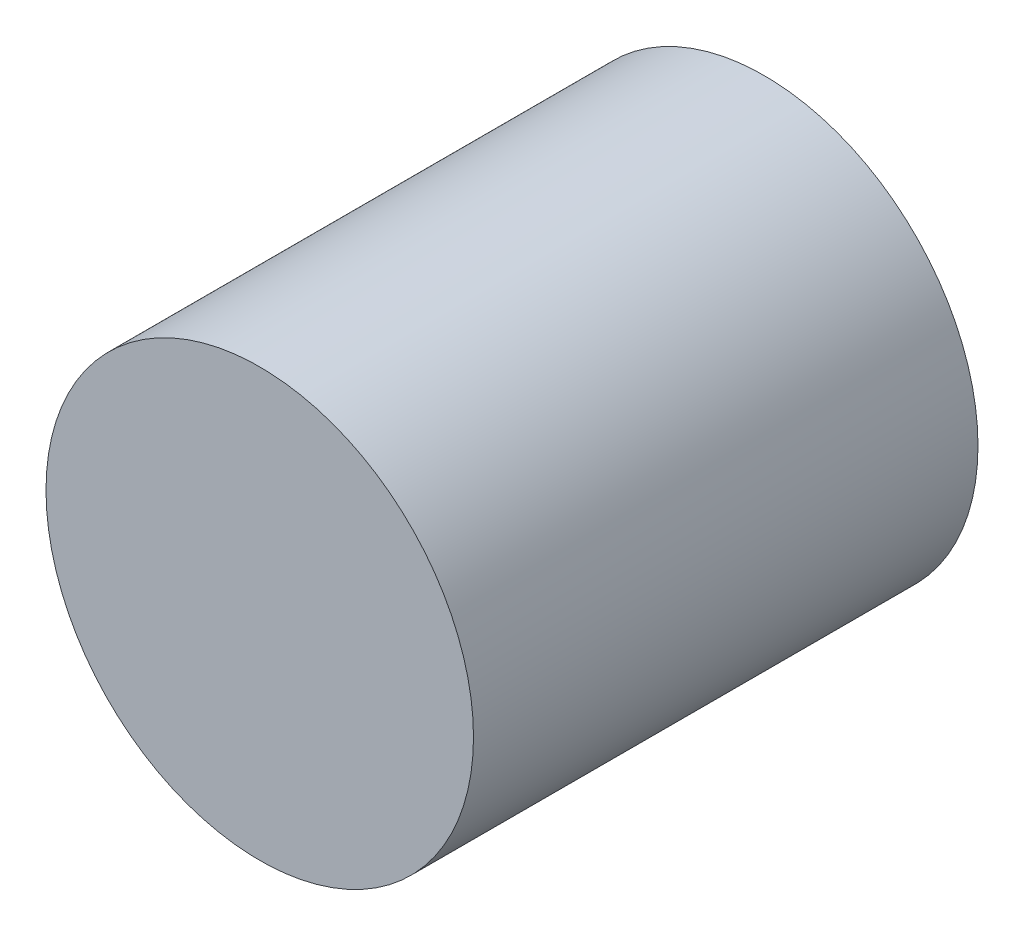
ISO-10303-21;
HEADER;
FILE_DESCRIPTION(('STEP AP214'),'2;1');
FILE_NAME('part.step','',(''),(''),'','','');
FILE_SCHEMA(('AUTOMOTIVE_DESIGN { 1 0 10303 214 1 1 1 1 }'));
ENDSEC;
DATA;
#1=APPLICATION_CONTEXT('core data for automotive mechanical design processes');
#2=APPLICATION_PROTOCOL_DEFINITION('international standard','automotive_design',2000,#1);
#3=PRODUCT_CONTEXT('',#1,'mechanical');
#4=PRODUCT('Part','Part','',(#3));
#5=PRODUCT_RELATED_PRODUCT_CATEGORY('part','',(#4));
#6=PRODUCT_DEFINITION_FORMATION('','',#4);
#7=PRODUCT_DEFINITION_CONTEXT('part definition',#1,'design');
#8=PRODUCT_DEFINITION('design','',#6,#7);
#9=PRODUCT_DEFINITION_SHAPE('','',#8);
#10=(LENGTH_UNIT() NAMED_UNIT(*) SI_UNIT(.MILLI.,.METRE.));
#11=(NAMED_UNIT(*) PLANE_ANGLE_UNIT() SI_UNIT($,.RADIAN.));
#12=(NAMED_UNIT(*) SI_UNIT($,.STERADIAN.) SOLID_ANGLE_UNIT());
#13=UNCERTAINTY_MEASURE_WITH_UNIT(LENGTH_MEASURE(1.E-05),#10,'distance_accuracy_value','');
#14=(GEOMETRIC_REPRESENTATION_CONTEXT(3) GLOBAL_UNCERTAINTY_ASSIGNED_CONTEXT((#13)) GLOBAL_UNIT_ASSIGNED_CONTEXT((#10,
#11,#12)) REPRESENTATION_CONTEXT('',''));
#15=CARTESIAN_POINT('',(0.,0.,0.));
#16=DIRECTION('',(0.,0.,1.));
#17=DIRECTION('',(1.,0.,0.));
#18=AXIS2_PLACEMENT_3D('',#15,#16,#17);
#19=CARTESIAN_POINT('',(0.,0.,38.));
#20=DIRECTION('',(0.,0.,-1.));
#21=DIRECTION('',(-1.,0.,0.));
#22=AXIS2_PLACEMENT_3D('',#19,#20,#21);
#23=CYLINDRICAL_SURFACE('',#22,16.1);
#24=CARTESIAN_POINT('',(0.,0.,38.));
#25=DIRECTION('',(0.,0.,1.));
#26=DIRECTION('',(1.,0.,0.));
#27=AXIS2_PLACEMENT_3D('',#24,#25,#26);
#28=CIRCLE('',#27,16.1);
#29=CARTESIAN_POINT('',(16.1,0.,38.));
#30=VERTEX_POINT('',#29);
#31=EDGE_CURVE('E10',#30,#30,#28,.T.);
#32=ORIENTED_EDGE('',*,*,#31,.F.);
#33=EDGE_LOOP('',(#32));
#34=FACE_BOUND('',#33,.T.);
#35=CARTESIAN_POINT('',(0.,0.,0.));
#36=DIRECTION('',(0.,0.,1.));
#37=DIRECTION('',(1.,0.,0.));
#38=AXIS2_PLACEMENT_3D('',#35,#36,#37);
#39=CIRCLE('',#38,16.1);
#40=CARTESIAN_POINT('',(16.1,0.,0.));
#41=VERTEX_POINT('',#40);
#42=EDGE_CURVE('E33',#41,#41,#39,.T.);
#43=ORIENTED_EDGE('',*,*,#42,.T.);
#44=EDGE_LOOP('',(#43));
#45=FACE_BOUND('',#44,.T.);
#46=ADVANCED_FACE('F30',(#34,#45),#23,.T.);
#47=CARTESIAN_POINT('',(0.,0.,38.));
#48=DIRECTION('',(0.,0.,1.));
#49=DIRECTION('',(1.,0.,0.));
#50=AXIS2_PLACEMENT_3D('',#47,#48,#49);
#51=PLANE('',#50);
#52=ORIENTED_EDGE('',*,*,#31,.T.);
#53=EDGE_LOOP('',(#52));
#54=FACE_BOUND('',#53,.T.);
#55=ADVANCED_FACE('F45',(#54),#51,.T.);
#56=CARTESIAN_POINT('',(0.,0.,0.));
#57=DIRECTION('',(0.,0.,1.));
#58=DIRECTION('',(1.,0.,0.));
#59=AXIS2_PLACEMENT_3D('',#56,#57,#58);
#60=PLANE('',#59);
#61=ORIENTED_EDGE('',*,*,#42,.F.);
#62=EDGE_LOOP('',(#61));
#63=FACE_BOUND('',#62,.T.);
#64=ADVANCED_FACE('F43',(#63),#60,.F.);
#65=CLOSED_SHELL('',(#46,#55,#64));
#66=MANIFOLD_SOLID_BREP('B2',#65);
#67=ADVANCED_BREP_SHAPE_REPRESENTATION('',(#18,#66),#14);
#68=SHAPE_DEFINITION_REPRESENTATION(#9,#67);
ENDSEC;
END-ISO-10303-21;
